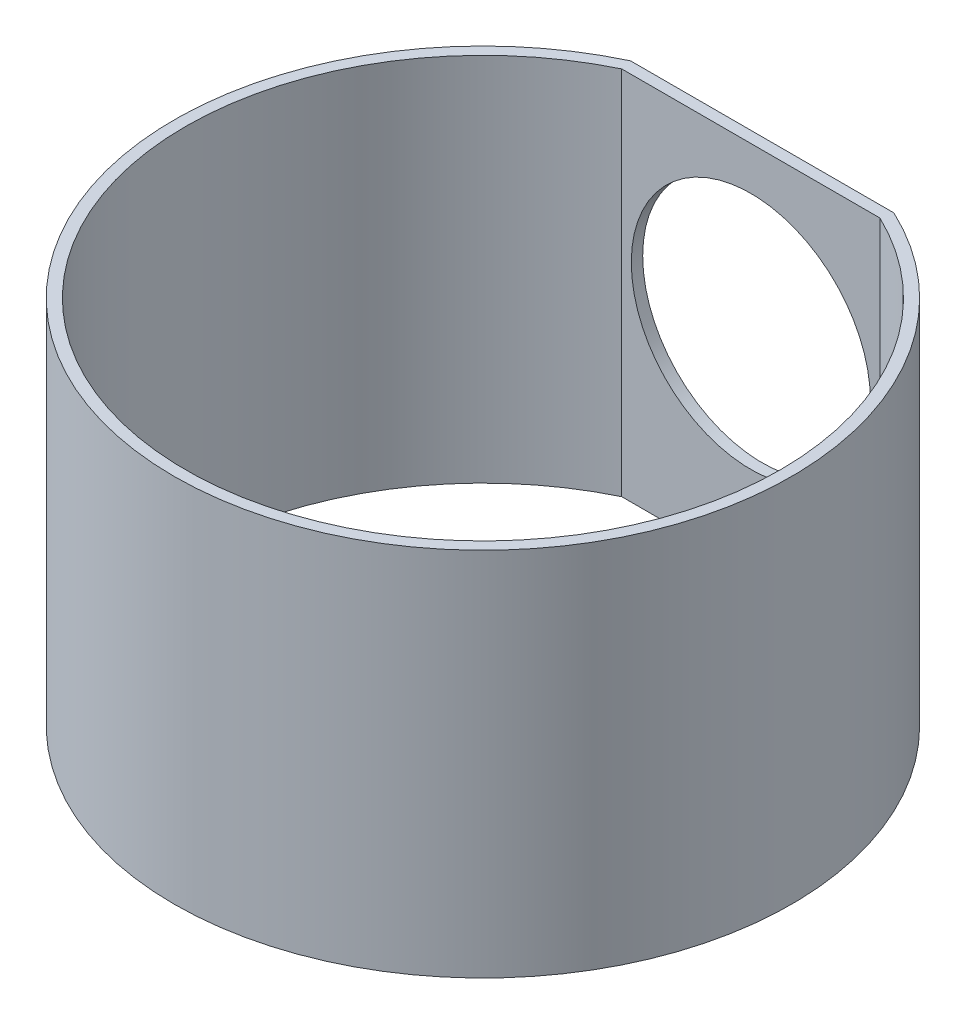
ISO-10303-21;
HEADER;
FILE_DESCRIPTION(('STEP AP214'),'2;1');
FILE_NAME('part.step','',(''),(''),'','','');
FILE_SCHEMA(('AUTOMOTIVE_DESIGN { 1 0 10303 214 1 1 1 1 }'));
ENDSEC;
DATA;
#1=APPLICATION_CONTEXT('core data for automotive mechanical design processes');
#2=APPLICATION_PROTOCOL_DEFINITION('international standard','automotive_design',2000,#1);
#3=PRODUCT_CONTEXT('',#1,'mechanical');
#4=PRODUCT('Part','Part','',(#3));
#5=PRODUCT_RELATED_PRODUCT_CATEGORY('part','',(#4));
#6=PRODUCT_DEFINITION_FORMATION('','',#4);
#7=PRODUCT_DEFINITION_CONTEXT('part definition',#1,'design');
#8=PRODUCT_DEFINITION('design','',#6,#7);
#9=PRODUCT_DEFINITION_SHAPE('','',#8);
#10=(LENGTH_UNIT() NAMED_UNIT(*) SI_UNIT(.MILLI.,.METRE.));
#11=(NAMED_UNIT(*) PLANE_ANGLE_UNIT() SI_UNIT($,.RADIAN.));
#12=(NAMED_UNIT(*) SI_UNIT($,.STERADIAN.) SOLID_ANGLE_UNIT());
#13=UNCERTAINTY_MEASURE_WITH_UNIT(LENGTH_MEASURE(1.E-05),#10,'distance_accuracy_value','');
#14=(GEOMETRIC_REPRESENTATION_CONTEXT(3) GLOBAL_UNCERTAINTY_ASSIGNED_CONTEXT((#13)) GLOBAL_UNIT_ASSIGNED_CONTEXT((#10,
#11,#12)) REPRESENTATION_CONTEXT('',''));
#15=CARTESIAN_POINT('',(0.,0.,0.));
#16=DIRECTION('',(0.,0.,1.));
#17=DIRECTION('',(1.,0.,0.));
#18=AXIS2_PLACEMENT_3D('',#15,#16,#17);
#19=CARTESIAN_POINT('',(-27.4355763074154,33.,-42.9352777809699));
#20=DIRECTION('',(0.,1.,0.));
#21=DIRECTION('',(0.,0.,1.));
#22=AXIS2_PLACEMENT_3D('',#19,#20,#21);
#23=PLANE('',#22);
#24=CARTESIAN_POINT('',(-27.4355763074154,33.,-42.9352777809699));
#25=DIRECTION('',(0.,1.,0.));
#26=DIRECTION('',(0.,0.,1.));
#27=AXIS2_PLACEMENT_3D('',#24,#25,#26);
#28=CIRCLE('',#27,27.506);
#29=CARTESIAN_POINT('',(-39.1653205654587,33.,-67.8148504388935));
#30=VERTEX_POINT('',#29);
#31=CARTESIAN_POINT('',(-15.7058320493721,33.,-67.8148504388935));
#32=VERTEX_POINT('',#31);
#33=EDGE_CURVE('E92',#30,#32,#28,.T.);
#34=ORIENTED_EDGE('',*,*,#33,.T.);
#35=DIRECTION('',(-1.,0.,0.));
#36=VECTOR('',#35,1.);
#37=CARTESIAN_POINT('',(-15.7058320493721,33.,-67.8148504388935));
#38=LINE('',#37,#36);
#39=EDGE_CURVE('E95',#32,#30,#38,.T.);
#40=ORIENTED_EDGE('',*,*,#39,.T.);
#41=EDGE_LOOP('',(#34,#40));
#42=FACE_BOUND('',#41,.T.);
#43=DIRECTION('',(-1.,0.,0.));
#44=VECTOR('',#43,1.);
#45=CARTESIAN_POINT('',(-15.9355763074154,33.,-66.7988504388935));
#46=LINE('',#45,#44);
#47=CARTESIAN_POINT('',(-15.9355763074154,33.,-66.7988504388935));
#48=VERTEX_POINT('',#47);
#49=CARTESIAN_POINT('',(-38.9355763074154,33.,-66.7988504388935));
#50=VERTEX_POINT('',#49);
#51=EDGE_CURVE('E73',#48,#50,#46,.T.);
#52=ORIENTED_EDGE('',*,*,#51,.F.);
#53=CARTESIAN_POINT('',(-27.4355763074154,33.,-42.9352777809699));
#54=DIRECTION('',(0.,1.,0.));
#55=DIRECTION('',(0.,0.,1.));
#56=AXIS2_PLACEMENT_3D('',#53,#54,#55);
#57=CIRCLE('',#56,26.49);
#58=EDGE_CURVE('E79',#50,#48,#57,.T.);
#59=ORIENTED_EDGE('',*,*,#58,.F.);
#60=EDGE_LOOP('',(#52,#59));
#61=FACE_BOUND('',#60,.T.);
#62=ADVANCED_FACE('F32',(#42,#61),#23,.T.);
#63=CARTESIAN_POINT('',(-27.4355763074154,0.,-42.9352777809699));
#64=DIRECTION('',(0.,1.,0.));
#65=DIRECTION('',(0.,0.,1.));
#66=AXIS2_PLACEMENT_3D('',#63,#64,#65);
#67=PLANE('',#66);
#68=CARTESIAN_POINT('',(-27.4355763074154,0.,-42.9352777809699));
#69=DIRECTION('',(0.,1.,0.));
#70=DIRECTION('',(0.,0.,1.));
#71=AXIS2_PLACEMENT_3D('',#68,#69,#70);
#72=CIRCLE('',#71,27.506);
#73=CARTESIAN_POINT('',(-39.1653205654587,0.,-67.8148504388935));
#74=VERTEX_POINT('',#73);
#75=CARTESIAN_POINT('',(-15.7058320493721,0.,-67.8148504388935));
#76=VERTEX_POINT('',#75);
#77=EDGE_CURVE('E91',#74,#76,#72,.T.);
#78=ORIENTED_EDGE('',*,*,#77,.F.);
#79=DIRECTION('',(-1.,0.,0.));
#80=VECTOR('',#79,1.);
#81=CARTESIAN_POINT('',(-15.7058320493721,0.,-67.8148504388935));
#82=LINE('',#81,#80);
#83=EDGE_CURVE('E96',#76,#74,#82,.T.);
#84=ORIENTED_EDGE('',*,*,#83,.F.);
#85=EDGE_LOOP('',(#78,#84));
#86=FACE_BOUND('',#85,.T.);
#87=CARTESIAN_POINT('',(-27.4355763074154,0.,-42.9352777809699));
#88=DIRECTION('',(0.,1.,0.));
#89=DIRECTION('',(0.,0.,1.));
#90=AXIS2_PLACEMENT_3D('',#87,#88,#89);
#91=CIRCLE('',#90,26.49);
#92=CARTESIAN_POINT('',(-38.9355763074154,0.,-66.7988504388935));
#93=VERTEX_POINT('',#92);
#94=CARTESIAN_POINT('',(-15.9355763074154,0.,-66.7988504388935));
#95=VERTEX_POINT('',#94);
#96=EDGE_CURVE('E55',#93,#95,#91,.T.);
#97=ORIENTED_EDGE('',*,*,#96,.T.);
#98=DIRECTION('',(-1.,0.,0.));
#99=VECTOR('',#98,1.);
#100=CARTESIAN_POINT('',(-15.9355763074154,0.,-66.7988504388935));
#101=LINE('',#100,#99);
#102=EDGE_CURVE('E83',#95,#93,#101,.T.);
#103=ORIENTED_EDGE('',*,*,#102,.T.);
#104=EDGE_LOOP('',(#97,#103));
#105=FACE_BOUND('',#104,.T.);
#106=ADVANCED_FACE('F109',(#86,#105),#67,.F.);
#107=CARTESIAN_POINT('',(-27.4355763074154,33.,-42.9352777809699));
#108=DIRECTION('',(0.,-1.,0.));
#109=DIRECTION('',(0.,0.,-1.));
#110=AXIS2_PLACEMENT_3D('',#107,#108,#109);
#111=CYLINDRICAL_SURFACE('',#110,27.506);
#112=ORIENTED_EDGE('',*,*,#77,.T.);
#113=DIRECTION('',(0.,-1.,0.));
#114=VECTOR('',#113,1.);
#115=CARTESIAN_POINT('',(-15.7058320493721,33.,-67.8148504388935));
#116=LINE('',#115,#114);
#117=EDGE_CURVE('E11',#32,#76,#116,.T.);
#118=ORIENTED_EDGE('',*,*,#117,.F.);
#119=ORIENTED_EDGE('',*,*,#33,.F.);
#120=DIRECTION('',(0.,-1.,0.));
#121=VECTOR('',#120,1.);
#122=CARTESIAN_POINT('',(-39.1653205654587,33.,-67.8148504388935));
#123=LINE('',#122,#121);
#124=EDGE_CURVE('E41',#30,#74,#123,.T.);
#125=ORIENTED_EDGE('',*,*,#124,.T.);
#126=EDGE_LOOP('',(#112,#118,#119,#125));
#127=FACE_BOUND('',#126,.T.);
#128=ADVANCED_FACE('F34',(#127),#111,.T.);
#129=CARTESIAN_POINT('',(-15.7058320493721,33.,-67.8148504388935));
#130=DIRECTION('',(0.,0.,1.));
#131=DIRECTION('',(1.,0.,0.));
#132=AXIS2_PLACEMENT_3D('',#129,#130,#131);
#133=PLANE('',#132);
#134=CARTESIAN_POINT('',(-27.4355763074154,18.5,-67.8148504388935));
#135=DIRECTION('',(0.,0.,-1.));
#136=DIRECTION('',(-1.,0.,0.));
#137=AXIS2_PLACEMENT_3D('',#134,#135,#136);
#138=CIRCLE('',#137,10.65);
#139=CARTESIAN_POINT('',(-38.0855763074154,18.5,-67.8148504388935));
#140=VERTEX_POINT('',#139);
#141=EDGE_CURVE('E87',#140,#140,#138,.T.);
#142=ORIENTED_EDGE('',*,*,#141,.F.);
#143=EDGE_LOOP('',(#142));
#144=FACE_BOUND('',#143,.T.);
#145=ORIENTED_EDGE('',*,*,#83,.T.);
#146=ORIENTED_EDGE('',*,*,#124,.F.);
#147=ORIENTED_EDGE('',*,*,#39,.F.);
#148=ORIENTED_EDGE('',*,*,#117,.T.);
#149=EDGE_LOOP('',(#145,#146,#147,#148));
#150=FACE_BOUND('',#149,.T.);
#151=ADVANCED_FACE('F111',(#144,#150),#133,.F.);
#152=CARTESIAN_POINT('',(-27.4355763074154,33.,-42.9352777809699));
#153=DIRECTION('',(0.,-1.,0.));
#154=DIRECTION('',(0.,0.,-1.));
#155=AXIS2_PLACEMENT_3D('',#152,#153,#154);
#156=CYLINDRICAL_SURFACE('',#155,26.49);
#157=ORIENTED_EDGE('',*,*,#96,.F.);
#158=DIRECTION('',(0.,-1.,0.));
#159=VECTOR('',#158,1.);
#160=CARTESIAN_POINT('',(-38.9355763074154,33.,-66.7988504388935));
#161=LINE('',#160,#159);
#162=EDGE_CURVE('E75',#50,#93,#161,.T.);
#163=ORIENTED_EDGE('',*,*,#162,.F.);
#164=ORIENTED_EDGE('',*,*,#58,.T.);
#165=DIRECTION('',(0.,-1.,0.));
#166=VECTOR('',#165,1.);
#167=CARTESIAN_POINT('',(-15.9355763074154,33.,-66.7988504388935));
#168=LINE('',#167,#166);
#169=EDGE_CURVE('E48',#48,#95,#168,.T.);
#170=ORIENTED_EDGE('',*,*,#169,.T.);
#171=EDGE_LOOP('',(#157,#163,#164,#170));
#172=FACE_BOUND('',#171,.T.);
#173=ADVANCED_FACE('F81',(#172),#156,.F.);
#174=CARTESIAN_POINT('',(-15.9355763074154,33.,-66.7988504388935));
#175=DIRECTION('',(0.,0.,1.));
#176=DIRECTION('',(1.,0.,0.));
#177=AXIS2_PLACEMENT_3D('',#174,#175,#176);
#178=PLANE('',#177);
#179=CARTESIAN_POINT('',(-27.4355763074154,18.5,-66.7988504388935));
#180=DIRECTION('',(0.,0.,1.));
#181=DIRECTION('',(1.,0.,0.));
#182=AXIS2_PLACEMENT_3D('',#179,#180,#181);
#183=CIRCLE('',#182,10.65);
#184=CARTESIAN_POINT('',(-16.7855763074154,18.5,-66.7988504388935));
#185=VERTEX_POINT('',#184);
#186=EDGE_CURVE('E36',#185,#185,#183,.T.);
#187=ORIENTED_EDGE('',*,*,#186,.F.);
#188=EDGE_LOOP('',(#187));
#189=FACE_BOUND('',#188,.T.);
#190=ORIENTED_EDGE('',*,*,#102,.F.);
#191=ORIENTED_EDGE('',*,*,#169,.F.);
#192=ORIENTED_EDGE('',*,*,#51,.T.);
#193=ORIENTED_EDGE('',*,*,#162,.T.);
#194=EDGE_LOOP('',(#190,#191,#192,#193));
#195=FACE_BOUND('',#194,.T.);
#196=ADVANCED_FACE('F74',(#189,#195),#178,.T.);
#197=CARTESIAN_POINT('',(-27.4355763074154,18.5,-57.8148504388935));
#198=DIRECTION('',(0.,0.,-1.));
#199=DIRECTION('',(-1.,0.,0.));
#200=AXIS2_PLACEMENT_3D('',#197,#198,#199);
#201=CYLINDRICAL_SURFACE('',#200,10.65);
#202=ORIENTED_EDGE('',*,*,#186,.T.);
#203=EDGE_LOOP('',(#202));
#204=FACE_BOUND('',#203,.T.);
#205=ORIENTED_EDGE('',*,*,#141,.T.);
#206=EDGE_LOOP('',(#205));
#207=FACE_BOUND('',#206,.T.);
#208=ADVANCED_FACE('F133',(#204,#207),#201,.F.);
#209=CLOSED_SHELL('',(#62,#106,#128,#151,#173,#196,#208));
#210=MANIFOLD_SOLID_BREP('B2',#209);
#211=ADVANCED_BREP_SHAPE_REPRESENTATION('',(#18,#210),#14);
#212=SHAPE_DEFINITION_REPRESENTATION(#9,#211);
ENDSEC;
END-ISO-10303-21;
